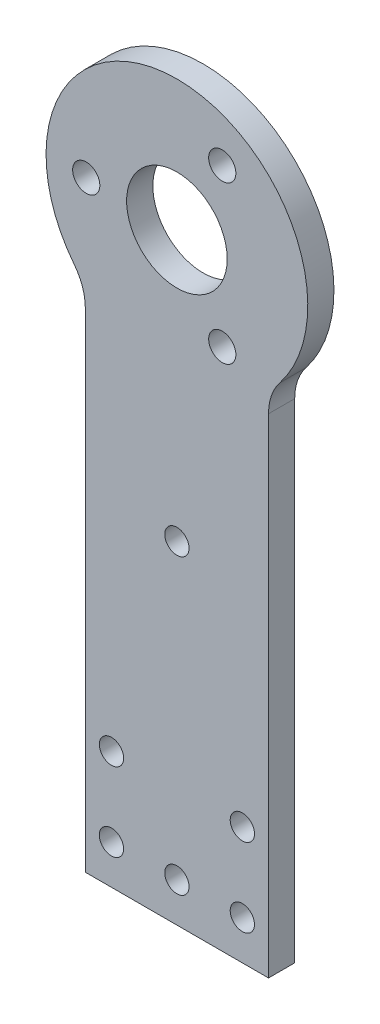
ISO-10303-21;
HEADER;
FILE_DESCRIPTION(('STEP AP214'),'2;1');
FILE_NAME('part.step','',(''),(''),'','','');
FILE_SCHEMA(('AUTOMOTIVE_DESIGN { 1 0 10303 214 1 1 1 1 }'));
ENDSEC;
DATA;
#1=APPLICATION_CONTEXT('core data for automotive mechanical design processes');
#2=APPLICATION_PROTOCOL_DEFINITION('international standard','automotive_design',2000,#1);
#3=PRODUCT_CONTEXT('',#1,'mechanical');
#4=PRODUCT('Part','Part','',(#3));
#5=PRODUCT_RELATED_PRODUCT_CATEGORY('part','',(#4));
#6=PRODUCT_DEFINITION_FORMATION('','',#4);
#7=PRODUCT_DEFINITION_CONTEXT('part definition',#1,'design');
#8=PRODUCT_DEFINITION('design','',#6,#7);
#9=PRODUCT_DEFINITION_SHAPE('','',#8);
#10=(LENGTH_UNIT() NAMED_UNIT(*) SI_UNIT(.MILLI.,.METRE.));
#11=(NAMED_UNIT(*) PLANE_ANGLE_UNIT() SI_UNIT($,.RADIAN.));
#12=(NAMED_UNIT(*) SI_UNIT($,.STERADIAN.) SOLID_ANGLE_UNIT());
#13=UNCERTAINTY_MEASURE_WITH_UNIT(LENGTH_MEASURE(1.E-05),#10,'distance_accuracy_value','');
#14=(GEOMETRIC_REPRESENTATION_CONTEXT(3) GLOBAL_UNCERTAINTY_ASSIGNED_CONTEXT((#13)) GLOBAL_UNIT_ASSIGNED_CONTEXT((#10,
#11,#12)) REPRESENTATION_CONTEXT('',''));
#15=CARTESIAN_POINT('',(0.,0.,0.));
#16=DIRECTION('',(0.,0.,1.));
#17=DIRECTION('',(1.,0.,0.));
#18=AXIS2_PLACEMENT_3D('',#15,#16,#17);
#19=CARTESIAN_POINT('',(0.,0.,0.));
#20=DIRECTION('',(0.,0.,1.));
#21=DIRECTION('',(1.,0.,0.));
#22=AXIS2_PLACEMENT_3D('',#19,#20,#21);
#23=PLANE('',#22);
#24=CARTESIAN_POINT('',(0.,-32.7025,0.));
#25=DIRECTION('',(0.,0.,-1.));
#26=DIRECTION('',(-1.,0.,0.));
#27=AXIS2_PLACEMENT_3D('',#24,#25,#26);
#28=CIRCLE('',#27,1.47319999999999);
#29=CARTESIAN_POINT('',(-1.47319999999999,-32.7025,0.));
#30=VERTEX_POINT('',#29);
#31=EDGE_CURVE('E369',#30,#30,#28,.T.);
#32=ORIENTED_EDGE('',*,*,#31,.F.);
#33=EDGE_LOOP('',(#32));
#34=FACE_BOUND('',#33,.T.);
#35=CARTESIAN_POINT('',(-7.9375,-68.2625,0.));
#36=DIRECTION('',(0.,0.,-1.));
#37=DIRECTION('',(-1.,0.,0.));
#38=AXIS2_PLACEMENT_3D('',#35,#36,#37);
#39=CIRCLE('',#38,1.4732);
#40=CARTESIAN_POINT('',(-9.4107,-68.2625,0.));
#41=VERTEX_POINT('',#40);
#42=EDGE_CURVE('E363',#41,#41,#39,.T.);
#43=ORIENTED_EDGE('',*,*,#42,.F.);
#44=EDGE_LOOP('',(#43));
#45=FACE_BOUND('',#44,.T.);
#46=CARTESIAN_POINT('',(7.9375,-68.2625,0.));
#47=DIRECTION('',(0.,0.,-1.));
#48=DIRECTION('',(-1.,0.,0.));
#49=AXIS2_PLACEMENT_3D('',#46,#47,#48);
#50=CIRCLE('',#49,1.4732);
#51=CARTESIAN_POINT('',(6.4643,-68.2625,0.));
#52=VERTEX_POINT('',#51);
#53=EDGE_CURVE('E357',#52,#52,#50,.T.);
#54=ORIENTED_EDGE('',*,*,#53,.F.);
#55=EDGE_LOOP('',(#54));
#56=FACE_BOUND('',#55,.T.);
#57=CARTESIAN_POINT('',(7.9375,-58.7375,0.));
#58=DIRECTION('',(0.,0.,-1.));
#59=DIRECTION('',(-1.,0.,0.));
#60=AXIS2_PLACEMENT_3D('',#57,#58,#59);
#61=CIRCLE('',#60,1.4732);
#62=CARTESIAN_POINT('',(6.4643,-58.7375,0.));
#63=VERTEX_POINT('',#62);
#64=EDGE_CURVE('E351',#63,#63,#61,.T.);
#65=ORIENTED_EDGE('',*,*,#64,.F.);
#66=EDGE_LOOP('',(#65));
#67=FACE_BOUND('',#66,.T.);
#68=CARTESIAN_POINT('',(-7.9375,-58.7375,0.));
#69=DIRECTION('',(0.,0.,-1.));
#70=DIRECTION('',(-1.,0.,0.));
#71=AXIS2_PLACEMENT_3D('',#68,#69,#70);
#72=CIRCLE('',#71,1.4732);
#73=CARTESIAN_POINT('',(-9.4107,-58.7375,0.));
#74=VERTEX_POINT('',#73);
#75=EDGE_CURVE('E345',#74,#74,#72,.T.);
#76=ORIENTED_EDGE('',*,*,#75,.F.);
#77=EDGE_LOOP('',(#76));
#78=FACE_BOUND('',#77,.T.);
#79=CARTESIAN_POINT('',(0.,0.,0.));
#80=DIRECTION('',(0.,0.,1.));
#81=DIRECTION('',(1.,0.,0.));
#82=AXIS2_PLACEMENT_3D('',#79,#80,#81);
#83=CIRCLE('',#82,15.875);
#84=CARTESIAN_POINT('',(12.4732142857143,-9.8201094893414,0.));
#85=VERTEX_POINT('',#84);
#86=CARTESIAN_POINT('',(-12.4732142857143,-9.82010948934141,0.));
#87=VERTEX_POINT('',#86);
#88=EDGE_CURVE('E119',#85,#87,#83,.T.);
#89=ORIENTED_EDGE('',*,*,#88,.F.);
#90=CARTESIAN_POINT('',(17.4625,-13.748153285078,0.));
#91=DIRECTION('',(0.,0.,1.));
#92=DIRECTION('',(1.,0.,0.));
#93=AXIS2_PLACEMENT_3D('',#90,#91,#92);
#94=CIRCLE('',#93,6.35);
#95=CARTESIAN_POINT('',(11.1125,-13.748153285078,0.));
#96=VERTEX_POINT('',#95);
#97=EDGE_CURVE('E43',#85,#96,#94,.T.);
#98=ORIENTED_EDGE('',*,*,#97,.T.);
#99=DIRECTION('',(0.,1.,0.));
#100=VECTOR('',#99,1.);
#101=CARTESIAN_POINT('',(11.1125,-11.3370176303118,0.));
#102=LINE('',#101,#100);
#103=CARTESIAN_POINT('',(11.1125,-73.025,0.));
#104=VERTEX_POINT('',#103);
#105=EDGE_CURVE('E126',#104,#96,#102,.T.);
#106=ORIENTED_EDGE('',*,*,#105,.F.);
#107=DIRECTION('',(1.,0.,0.));
#108=VECTOR('',#107,1.);
#109=CARTESIAN_POINT('',(11.1125,-73.025,0.));
#110=LINE('',#109,#108);
#111=CARTESIAN_POINT('',(-11.1125,-73.025,0.));
#112=VERTEX_POINT('',#111);
#113=EDGE_CURVE('E124',#112,#104,#110,.T.);
#114=ORIENTED_EDGE('',*,*,#113,.F.);
#115=DIRECTION('',(0.,-1.,0.));
#116=VECTOR('',#115,1.);
#117=CARTESIAN_POINT('',(-11.1125,-11.3370176303118,0.));
#118=LINE('',#117,#116);
#119=CARTESIAN_POINT('',(-11.1125,-13.748153285078,0.));
#120=VERTEX_POINT('',#119);
#121=EDGE_CURVE('E106',#120,#112,#118,.T.);
#122=ORIENTED_EDGE('',*,*,#121,.F.);
#123=CARTESIAN_POINT('',(-17.4625,-13.748153285078,0.));
#124=DIRECTION('',(0.,0.,1.));
#125=DIRECTION('',(1.,0.,0.));
#126=AXIS2_PLACEMENT_3D('',#123,#124,#125);
#127=CIRCLE('',#126,6.35);
#128=EDGE_CURVE('E136',#120,#87,#127,.T.);
#129=ORIENTED_EDGE('',*,*,#128,.T.);
#130=EDGE_LOOP('',(#89,#98,#106,#114,#122,#129));
#131=FACE_BOUND('',#130,.T.);
#132=CARTESIAN_POINT('',(-11.,0.,0.));
#133=DIRECTION('',(0.,0.,1.));
#134=DIRECTION('',(1.,0.,0.));
#135=AXIS2_PLACEMENT_3D('',#132,#133,#134);
#136=CIRCLE('',#135,1.65);
#137=CARTESIAN_POINT('',(-9.35,0.,0.));
#138=VERTEX_POINT('',#137);
#139=EDGE_CURVE('E319',#138,#138,#136,.T.);
#140=ORIENTED_EDGE('',*,*,#139,.T.);
#141=EDGE_LOOP('',(#140));
#142=FACE_BOUND('',#141,.T.);
#143=CARTESIAN_POINT('',(5.5,9.52627944162883,0.));
#144=DIRECTION('',(0.,0.,1.));
#145=DIRECTION('',(1.,0.,0.));
#146=AXIS2_PLACEMENT_3D('',#143,#144,#145);
#147=CIRCLE('',#146,1.65);
#148=CARTESIAN_POINT('',(7.15,9.52627944162883,0.));
#149=VERTEX_POINT('',#148);
#150=EDGE_CURVE('E324',#149,#149,#147,.T.);
#151=ORIENTED_EDGE('',*,*,#150,.T.);
#152=EDGE_LOOP('',(#151));
#153=FACE_BOUND('',#152,.T.);
#154=CARTESIAN_POINT('',(5.50000000000001,-9.52627944162882,0.));
#155=DIRECTION('',(0.,0.,1.));
#156=DIRECTION('',(1.,0.,0.));
#157=AXIS2_PLACEMENT_3D('',#154,#155,#156);
#158=CIRCLE('',#157,1.65);
#159=CARTESIAN_POINT('',(7.15000000000001,-9.52627944162882,0.));
#160=VERTEX_POINT('',#159);
#161=EDGE_CURVE('E331',#160,#160,#158,.T.);
#162=ORIENTED_EDGE('',*,*,#161,.T.);
#163=EDGE_LOOP('',(#162));
#164=FACE_BOUND('',#163,.T.);
#165=CARTESIAN_POINT('',(0.,0.,0.));
#166=DIRECTION('',(0.,0.,1.));
#167=DIRECTION('',(1.,0.,0.));
#168=AXIS2_PLACEMENT_3D('',#165,#166,#167);
#169=CIRCLE('',#168,6.1);
#170=CARTESIAN_POINT('',(6.1,0.,0.));
#171=VERTEX_POINT('',#170);
#172=EDGE_CURVE('E337',#171,#171,#169,.T.);
#173=ORIENTED_EDGE('',*,*,#172,.T.);
#174=EDGE_LOOP('',(#173));
#175=FACE_BOUND('',#174,.T.);
#176=CARTESIAN_POINT('',(0.,-68.2625,0.));
#177=DIRECTION('',(0.,0.,-1.));
#178=DIRECTION('',(-1.,0.,0.));
#179=AXIS2_PLACEMENT_3D('',#176,#177,#178);
#180=CIRCLE('',#179,1.47319999999999);
#181=CARTESIAN_POINT('',(-1.47319999999999,-68.2625,0.));
#182=VERTEX_POINT('',#181);
#183=EDGE_CURVE('E375',#182,#182,#180,.T.);
#184=ORIENTED_EDGE('',*,*,#183,.F.);
#185=EDGE_LOOP('',(#184));
#186=FACE_BOUND('',#185,.T.);
#187=ADVANCED_FACE('F35',(#34,#45,#56,#67,#78,#131,#142,#153,#164,#175,#186),#23,.F.);
#188=CARTESIAN_POINT('',(0.,0.,3.175));
#189=DIRECTION('',(0.,0.,1.));
#190=DIRECTION('',(1.,0.,0.));
#191=AXIS2_PLACEMENT_3D('',#188,#189,#190);
#192=PLANE('',#191);
#193=CARTESIAN_POINT('',(0.,-68.2625,3.175));
#194=DIRECTION('',(0.,0.,1.));
#195=DIRECTION('',(1.,0.,0.));
#196=AXIS2_PLACEMENT_3D('',#193,#194,#195);
#197=CIRCLE('',#196,1.47319999999999);
#198=CARTESIAN_POINT('',(1.47319999999999,-68.2625,3.175));
#199=VERTEX_POINT('',#198);
#200=EDGE_CURVE('E372',#199,#199,#197,.T.);
#201=ORIENTED_EDGE('',*,*,#200,.F.);
#202=EDGE_LOOP('',(#201));
#203=FACE_BOUND('',#202,.T.);
#204=CARTESIAN_POINT('',(0.,-32.7025,3.175));
#205=DIRECTION('',(0.,0.,1.));
#206=DIRECTION('',(1.,0.,0.));
#207=AXIS2_PLACEMENT_3D('',#204,#205,#206);
#208=CIRCLE('',#207,1.47319999999999);
#209=CARTESIAN_POINT('',(1.47319999999999,-32.7025,3.175));
#210=VERTEX_POINT('',#209);
#211=EDGE_CURVE('E366',#210,#210,#208,.T.);
#212=ORIENTED_EDGE('',*,*,#211,.F.);
#213=EDGE_LOOP('',(#212));
#214=FACE_BOUND('',#213,.T.);
#215=CARTESIAN_POINT('',(-7.9375,-68.2625,3.175));
#216=DIRECTION('',(0.,0.,1.));
#217=DIRECTION('',(1.,0.,0.));
#218=AXIS2_PLACEMENT_3D('',#215,#216,#217);
#219=CIRCLE('',#218,1.4732);
#220=CARTESIAN_POINT('',(-6.4643,-68.2625,3.175));
#221=VERTEX_POINT('',#220);
#222=EDGE_CURVE('E360',#221,#221,#219,.T.);
#223=ORIENTED_EDGE('',*,*,#222,.F.);
#224=EDGE_LOOP('',(#223));
#225=FACE_BOUND('',#224,.T.);
#226=CARTESIAN_POINT('',(7.9375,-68.2625,3.175));
#227=DIRECTION('',(0.,0.,1.));
#228=DIRECTION('',(1.,0.,0.));
#229=AXIS2_PLACEMENT_3D('',#226,#227,#228);
#230=CIRCLE('',#229,1.4732);
#231=CARTESIAN_POINT('',(9.4107,-68.2625,3.175));
#232=VERTEX_POINT('',#231);
#233=EDGE_CURVE('E354',#232,#232,#230,.T.);
#234=ORIENTED_EDGE('',*,*,#233,.F.);
#235=EDGE_LOOP('',(#234));
#236=FACE_BOUND('',#235,.T.);
#237=CARTESIAN_POINT('',(7.9375,-58.7375,3.175));
#238=DIRECTION('',(0.,0.,1.));
#239=DIRECTION('',(1.,0.,0.));
#240=AXIS2_PLACEMENT_3D('',#237,#238,#239);
#241=CIRCLE('',#240,1.4732);
#242=CARTESIAN_POINT('',(9.4107,-58.7375,3.175));
#243=VERTEX_POINT('',#242);
#244=EDGE_CURVE('E348',#243,#243,#241,.T.);
#245=ORIENTED_EDGE('',*,*,#244,.F.);
#246=EDGE_LOOP('',(#245));
#247=FACE_BOUND('',#246,.T.);
#248=CARTESIAN_POINT('',(-7.9375,-58.7375,3.175));
#249=DIRECTION('',(0.,0.,1.));
#250=DIRECTION('',(1.,0.,0.));
#251=AXIS2_PLACEMENT_3D('',#248,#249,#250);
#252=CIRCLE('',#251,1.4732);
#253=CARTESIAN_POINT('',(-6.4643,-58.7375,3.175));
#254=VERTEX_POINT('',#253);
#255=EDGE_CURVE('E340',#254,#254,#252,.T.);
#256=ORIENTED_EDGE('',*,*,#255,.F.);
#257=EDGE_LOOP('',(#256));
#258=FACE_BOUND('',#257,.T.);
#259=CARTESIAN_POINT('',(5.50000000000001,-9.52627944162882,3.175));
#260=DIRECTION('',(0.,0.,1.));
#261=DIRECTION('',(1.,0.,0.));
#262=AXIS2_PLACEMENT_3D('',#259,#260,#261);
#263=CIRCLE('',#262,1.65);
#264=CARTESIAN_POINT('',(7.15000000000001,-9.52627944162882,3.175));
#265=VERTEX_POINT('',#264);
#266=EDGE_CURVE('E329',#265,#265,#263,.T.);
#267=ORIENTED_EDGE('',*,*,#266,.F.);
#268=EDGE_LOOP('',(#267));
#269=FACE_BOUND('',#268,.T.);
#270=CARTESIAN_POINT('',(-11.,0.,3.175));
#271=DIRECTION('',(0.,0.,1.));
#272=DIRECTION('',(1.,0.,0.));
#273=AXIS2_PLACEMENT_3D('',#270,#271,#272);
#274=CIRCLE('',#273,1.65);
#275=CARTESIAN_POINT('',(-9.35,0.,3.175));
#276=VERTEX_POINT('',#275);
#277=EDGE_CURVE('E122',#276,#276,#274,.T.);
#278=ORIENTED_EDGE('',*,*,#277,.F.);
#279=EDGE_LOOP('',(#278));
#280=FACE_BOUND('',#279,.T.);
#281=DIRECTION('',(0.,1.,0.));
#282=VECTOR('',#281,1.);
#283=CARTESIAN_POINT('',(11.1125,-11.3370176303118,3.175));
#284=LINE('',#283,#282);
#285=CARTESIAN_POINT('',(11.1125,-73.025,3.175));
#286=VERTEX_POINT('',#285);
#287=CARTESIAN_POINT('',(11.1125,-13.748153285078,3.175));
#288=VERTEX_POINT('',#287);
#289=EDGE_CURVE('E114',#286,#288,#284,.T.);
#290=ORIENTED_EDGE('',*,*,#289,.T.);
#291=CARTESIAN_POINT('',(17.4625,-13.748153285078,3.175));
#292=DIRECTION('',(0.,0.,1.));
#293=DIRECTION('',(1.,0.,0.));
#294=AXIS2_PLACEMENT_3D('',#291,#292,#293);
#295=CIRCLE('',#294,6.35);
#296=CARTESIAN_POINT('',(12.4732142857143,-9.8201094893414,3.175));
#297=VERTEX_POINT('',#296);
#298=EDGE_CURVE('E11',#288,#297,#295,.F.);
#299=ORIENTED_EDGE('',*,*,#298,.T.);
#300=CARTESIAN_POINT('',(0.,0.,3.175));
#301=DIRECTION('',(0.,0.,1.));
#302=DIRECTION('',(1.,0.,0.));
#303=AXIS2_PLACEMENT_3D('',#300,#301,#302);
#304=CIRCLE('',#303,15.875);
#305=CARTESIAN_POINT('',(-12.4732142857143,-9.82010948934141,3.175));
#306=VERTEX_POINT('',#305);
#307=EDGE_CURVE('E100',#297,#306,#304,.T.);
#308=ORIENTED_EDGE('',*,*,#307,.T.);
#309=CARTESIAN_POINT('',(-17.4625,-13.748153285078,3.175));
#310=DIRECTION('',(0.,0.,1.));
#311=DIRECTION('',(1.,0.,0.));
#312=AXIS2_PLACEMENT_3D('',#309,#310,#311);
#313=CIRCLE('',#312,6.35);
#314=CARTESIAN_POINT('',(-11.1125,-13.748153285078,3.175));
#315=VERTEX_POINT('',#314);
#316=EDGE_CURVE('E96',#306,#315,#313,.F.);
#317=ORIENTED_EDGE('',*,*,#316,.T.);
#318=DIRECTION('',(0.,-1.,0.));
#319=VECTOR('',#318,1.);
#320=CARTESIAN_POINT('',(-11.1125,-11.3370176303118,3.175));
#321=LINE('',#320,#319);
#322=CARTESIAN_POINT('',(-11.1125,-73.025,3.175));
#323=VERTEX_POINT('',#322);
#324=EDGE_CURVE('E87',#315,#323,#321,.T.);
#325=ORIENTED_EDGE('',*,*,#324,.T.);
#326=DIRECTION('',(1.,0.,0.));
#327=VECTOR('',#326,1.);
#328=CARTESIAN_POINT('',(11.1125,-73.025,3.175));
#329=LINE('',#328,#327);
#330=EDGE_CURVE('E92',#323,#286,#329,.T.);
#331=ORIENTED_EDGE('',*,*,#330,.T.);
#332=EDGE_LOOP('',(#290,#299,#308,#317,#325,#331));
#333=FACE_BOUND('',#332,.T.);
#334=CARTESIAN_POINT('',(5.5,9.52627944162883,3.175));
#335=DIRECTION('',(0.,0.,1.));
#336=DIRECTION('',(1.,0.,0.));
#337=AXIS2_PLACEMENT_3D('',#334,#335,#336);
#338=CIRCLE('',#337,1.65);
#339=CARTESIAN_POINT('',(7.15,9.52627944162883,3.175));
#340=VERTEX_POINT('',#339);
#341=EDGE_CURVE('E320',#340,#340,#338,.T.);
#342=ORIENTED_EDGE('',*,*,#341,.F.);
#343=EDGE_LOOP('',(#342));
#344=FACE_BOUND('',#343,.T.);
#345=CARTESIAN_POINT('',(0.,0.,3.175));
#346=DIRECTION('',(0.,0.,1.));
#347=DIRECTION('',(1.,0.,0.));
#348=AXIS2_PLACEMENT_3D('',#345,#346,#347);
#349=CIRCLE('',#348,6.1);
#350=CARTESIAN_POINT('',(6.1,0.,3.175));
#351=VERTEX_POINT('',#350);
#352=EDGE_CURVE('E334',#351,#351,#349,.T.);
#353=ORIENTED_EDGE('',*,*,#352,.F.);
#354=EDGE_LOOP('',(#353));
#355=FACE_BOUND('',#354,.T.);
#356=ADVANCED_FACE('F89',(#203,#214,#225,#236,#247,#258,#269,#280,#333,#344,#355),#192,.T.);
#357=CARTESIAN_POINT('',(0.,0.,3.175));
#358=DIRECTION('',(0.,0.,-1.));
#359=DIRECTION('',(-1.,0.,0.));
#360=AXIS2_PLACEMENT_3D('',#357,#358,#359);
#361=CYLINDRICAL_SURFACE('',#360,15.875);
#362=ORIENTED_EDGE('',*,*,#88,.T.);
#363=DIRECTION('',(0.,0.,-1.));
#364=VECTOR('',#363,1.);
#365=CARTESIAN_POINT('',(-12.4732142857143,-9.82010948934141,3.175));
#366=LINE('',#365,#364);
#367=EDGE_CURVE('E133',#87,#306,#366,.F.);
#368=ORIENTED_EDGE('',*,*,#367,.T.);
#369=ORIENTED_EDGE('',*,*,#307,.F.);
#370=DIRECTION('',(0.,0.,-1.));
#371=VECTOR('',#370,1.);
#372=CARTESIAN_POINT('',(12.4732142857143,-9.82010948934141,3.175));
#373=LINE('',#372,#371);
#374=EDGE_CURVE('E130',#297,#85,#373,.T.);
#375=ORIENTED_EDGE('',*,*,#374,.T.);
#376=EDGE_LOOP('',(#362,#368,#369,#375));
#377=FACE_BOUND('',#376,.T.);
#378=ADVANCED_FACE('F142',(#377),#361,.T.);
#379=CARTESIAN_POINT('',(-11.1125,-11.3370176303118,3.175));
#380=DIRECTION('',(1.,0.,0.));
#381=DIRECTION('',(0.,1.,0.));
#382=AXIS2_PLACEMENT_3D('',#379,#380,#381);
#383=PLANE('',#382);
#384=ORIENTED_EDGE('',*,*,#324,.F.);
#385=DIRECTION('',(0.,0.,1.));
#386=VECTOR('',#385,1.);
#387=CARTESIAN_POINT('',(-11.1125,-13.748153285078,0.));
#388=LINE('',#387,#386);
#389=EDGE_CURVE('E109',#315,#120,#388,.F.);
#390=ORIENTED_EDGE('',*,*,#389,.T.);
#391=ORIENTED_EDGE('',*,*,#121,.T.);
#392=DIRECTION('',(0.,0.,-1.));
#393=VECTOR('',#392,1.);
#394=CARTESIAN_POINT('',(-11.1125,-73.025,3.175));
#395=LINE('',#394,#393);
#396=EDGE_CURVE('E103',#323,#112,#395,.T.);
#397=ORIENTED_EDGE('',*,*,#396,.F.);
#398=EDGE_LOOP('',(#384,#390,#391,#397));
#399=FACE_BOUND('',#398,.T.);
#400=ADVANCED_FACE('F104',(#399),#383,.F.);
#401=CARTESIAN_POINT('',(11.1125,-73.025,3.175));
#402=DIRECTION('',(0.,1.,0.));
#403=DIRECTION('',(0.,0.,1.));
#404=AXIS2_PLACEMENT_3D('',#401,#402,#403);
#405=PLANE('',#404);
#406=ORIENTED_EDGE('',*,*,#113,.T.);
#407=DIRECTION('',(0.,0.,-1.));
#408=VECTOR('',#407,1.);
#409=CARTESIAN_POINT('',(11.1125,-73.025,3.175));
#410=LINE('',#409,#408);
#411=EDGE_CURVE('E110',#286,#104,#410,.T.);
#412=ORIENTED_EDGE('',*,*,#411,.F.);
#413=ORIENTED_EDGE('',*,*,#330,.F.);
#414=ORIENTED_EDGE('',*,*,#396,.T.);
#415=EDGE_LOOP('',(#406,#412,#413,#414));
#416=FACE_BOUND('',#415,.T.);
#417=ADVANCED_FACE('F112',(#416),#405,.F.);
#418=CARTESIAN_POINT('',(11.1125,-11.3370176303118,3.175));
#419=DIRECTION('',(-1.,0.,0.));
#420=DIRECTION('',(0.,-1.,0.));
#421=AXIS2_PLACEMENT_3D('',#418,#419,#420);
#422=PLANE('',#421);
#423=ORIENTED_EDGE('',*,*,#105,.T.);
#424=DIRECTION('',(0.,0.,1.));
#425=VECTOR('',#424,1.);
#426=CARTESIAN_POINT('',(11.1125,-13.748153285078,3.175));
#427=LINE('',#426,#425);
#428=EDGE_CURVE('E50',#96,#288,#427,.T.);
#429=ORIENTED_EDGE('',*,*,#428,.T.);
#430=ORIENTED_EDGE('',*,*,#289,.F.);
#431=ORIENTED_EDGE('',*,*,#411,.T.);
#432=EDGE_LOOP('',(#423,#429,#430,#431));
#433=FACE_BOUND('',#432,.T.);
#434=ADVANCED_FACE('F170',(#433),#422,.F.);
#435=CARTESIAN_POINT('',(-11.,0.,3.175));
#436=DIRECTION('',(0.,0.,-1.));
#437=DIRECTION('',(-1.,0.,0.));
#438=AXIS2_PLACEMENT_3D('',#435,#436,#437);
#439=CYLINDRICAL_SURFACE('',#438,1.65);
#440=ORIENTED_EDGE('',*,*,#277,.T.);
#441=EDGE_LOOP('',(#440));
#442=FACE_BOUND('',#441,.T.);
#443=ORIENTED_EDGE('',*,*,#139,.F.);
#444=EDGE_LOOP('',(#443));
#445=FACE_BOUND('',#444,.T.);
#446=ADVANCED_FACE('F173',(#442,#445),#439,.F.);
#447=CARTESIAN_POINT('',(5.5,9.52627944162883,3.175));
#448=DIRECTION('',(0.,0.,-1.));
#449=DIRECTION('',(-1.,0.,0.));
#450=AXIS2_PLACEMENT_3D('',#447,#448,#449);
#451=CYLINDRICAL_SURFACE('',#450,1.65);
#452=ORIENTED_EDGE('',*,*,#341,.T.);
#453=EDGE_LOOP('',(#452));
#454=FACE_BOUND('',#453,.T.);
#455=ORIENTED_EDGE('',*,*,#150,.F.);
#456=EDGE_LOOP('',(#455));
#457=FACE_BOUND('',#456,.T.);
#458=ADVANCED_FACE('F271',(#454,#457),#451,.F.);
#459=CARTESIAN_POINT('',(5.50000000000001,-9.52627944162882,3.175));
#460=DIRECTION('',(0.,0.,-1.));
#461=DIRECTION('',(-1.,0.,0.));
#462=AXIS2_PLACEMENT_3D('',#459,#460,#461);
#463=CYLINDRICAL_SURFACE('',#462,1.65);
#464=ORIENTED_EDGE('',*,*,#266,.T.);
#465=EDGE_LOOP('',(#464));
#466=FACE_BOUND('',#465,.T.);
#467=ORIENTED_EDGE('',*,*,#161,.F.);
#468=EDGE_LOOP('',(#467));
#469=FACE_BOUND('',#468,.T.);
#470=ADVANCED_FACE('F262',(#466,#469),#463,.F.);
#471=CARTESIAN_POINT('',(0.,0.,3.175));
#472=DIRECTION('',(0.,0.,-1.));
#473=DIRECTION('',(-1.,0.,0.));
#474=AXIS2_PLACEMENT_3D('',#471,#472,#473);
#475=CYLINDRICAL_SURFACE('',#474,6.1);
#476=ORIENTED_EDGE('',*,*,#352,.T.);
#477=EDGE_LOOP('',(#476));
#478=FACE_BOUND('',#477,.T.);
#479=ORIENTED_EDGE('',*,*,#172,.F.);
#480=EDGE_LOOP('',(#479));
#481=FACE_BOUND('',#480,.T.);
#482=ADVANCED_FACE('F253',(#478,#481),#475,.F.);
#483=CARTESIAN_POINT('',(-7.9375,-58.7375,0.));
#484=DIRECTION('',(0.,0.,-1.));
#485=DIRECTION('',(-1.,0.,0.));
#486=AXIS2_PLACEMENT_3D('',#483,#484,#485);
#487=CYLINDRICAL_SURFACE('',#486,1.4732);
#488=ORIENTED_EDGE('',*,*,#255,.T.);
#489=EDGE_LOOP('',(#488));
#490=FACE_BOUND('',#489,.T.);
#491=ORIENTED_EDGE('',*,*,#75,.T.);
#492=EDGE_LOOP('',(#491));
#493=FACE_BOUND('',#492,.T.);
#494=ADVANCED_FACE('F244',(#490,#493),#487,.F.);
#495=CARTESIAN_POINT('',(7.9375,-58.7375,0.));
#496=DIRECTION('',(0.,0.,-1.));
#497=DIRECTION('',(-1.,0.,0.));
#498=AXIS2_PLACEMENT_3D('',#495,#496,#497);
#499=CYLINDRICAL_SURFACE('',#498,1.4732);
#500=ORIENTED_EDGE('',*,*,#244,.T.);
#501=EDGE_LOOP('',(#500));
#502=FACE_BOUND('',#501,.T.);
#503=ORIENTED_EDGE('',*,*,#64,.T.);
#504=EDGE_LOOP('',(#503));
#505=FACE_BOUND('',#504,.T.);
#506=ADVANCED_FACE('F235',(#502,#505),#499,.F.);
#507=CARTESIAN_POINT('',(7.9375,-68.2625,0.));
#508=DIRECTION('',(0.,0.,-1.));
#509=DIRECTION('',(-1.,0.,0.));
#510=AXIS2_PLACEMENT_3D('',#507,#508,#509);
#511=CYLINDRICAL_SURFACE('',#510,1.4732);
#512=ORIENTED_EDGE('',*,*,#233,.T.);
#513=EDGE_LOOP('',(#512));
#514=FACE_BOUND('',#513,.T.);
#515=ORIENTED_EDGE('',*,*,#53,.T.);
#516=EDGE_LOOP('',(#515));
#517=FACE_BOUND('',#516,.T.);
#518=ADVANCED_FACE('F226',(#514,#517),#511,.F.);
#519=CARTESIAN_POINT('',(-7.9375,-68.2625,0.));
#520=DIRECTION('',(0.,0.,-1.));
#521=DIRECTION('',(-1.,0.,0.));
#522=AXIS2_PLACEMENT_3D('',#519,#520,#521);
#523=CYLINDRICAL_SURFACE('',#522,1.4732);
#524=ORIENTED_EDGE('',*,*,#222,.T.);
#525=EDGE_LOOP('',(#524));
#526=FACE_BOUND('',#525,.T.);
#527=ORIENTED_EDGE('',*,*,#42,.T.);
#528=EDGE_LOOP('',(#527));
#529=FACE_BOUND('',#528,.T.);
#530=ADVANCED_FACE('F213',(#526,#529),#523,.F.);
#531=CARTESIAN_POINT('',(0.,-32.7025,0.));
#532=DIRECTION('',(0.,0.,-1.));
#533=DIRECTION('',(-1.,0.,0.));
#534=AXIS2_PLACEMENT_3D('',#531,#532,#533);
#535=CYLINDRICAL_SURFACE('',#534,1.47319999999999);
#536=ORIENTED_EDGE('',*,*,#31,.T.);
#537=EDGE_LOOP('',(#536));
#538=FACE_BOUND('',#537,.T.);
#539=ORIENTED_EDGE('',*,*,#211,.T.);
#540=EDGE_LOOP('',(#539));
#541=FACE_BOUND('',#540,.T.);
#542=ADVANCED_FACE('F153',(#538,#541),#535,.F.);
#543=CARTESIAN_POINT('',(0.,-68.2625,0.));
#544=DIRECTION('',(0.,0.,-1.));
#545=DIRECTION('',(-1.,0.,0.));
#546=AXIS2_PLACEMENT_3D('',#543,#544,#545);
#547=CYLINDRICAL_SURFACE('',#546,1.47319999999999);
#548=ORIENTED_EDGE('',*,*,#183,.T.);
#549=EDGE_LOOP('',(#548));
#550=FACE_BOUND('',#549,.T.);
#551=ORIENTED_EDGE('',*,*,#200,.T.);
#552=EDGE_LOOP('',(#551));
#553=FACE_BOUND('',#552,.T.);
#554=ADVANCED_FACE('F147',(#550,#553),#547,.F.);
#555=CARTESIAN_POINT('',(-17.4625,-13.748153285078,3.175));
#556=DIRECTION('',(0.,0.,-1.));
#557=DIRECTION('',(-1.,0.,0.));
#558=AXIS2_PLACEMENT_3D('',#555,#556,#557);
#559=CYLINDRICAL_SURFACE('',#558,6.35);
#560=ORIENTED_EDGE('',*,*,#316,.F.);
#561=ORIENTED_EDGE('',*,*,#367,.F.);
#562=ORIENTED_EDGE('',*,*,#128,.F.);
#563=ORIENTED_EDGE('',*,*,#389,.F.);
#564=EDGE_LOOP('',(#560,#561,#562,#563));
#565=FACE_BOUND('',#564,.T.);
#566=ADVANCED_FACE('F145',(#565),#559,.F.);
#567=CARTESIAN_POINT('',(17.4625,-13.748153285078,3.175));
#568=DIRECTION('',(0.,0.,-1.));
#569=DIRECTION('',(-1.,0.,0.));
#570=AXIS2_PLACEMENT_3D('',#567,#568,#569);
#571=CYLINDRICAL_SURFACE('',#570,6.35);
#572=ORIENTED_EDGE('',*,*,#298,.F.);
#573=ORIENTED_EDGE('',*,*,#428,.F.);
#574=ORIENTED_EDGE('',*,*,#97,.F.);
#575=ORIENTED_EDGE('',*,*,#374,.F.);
#576=EDGE_LOOP('',(#572,#573,#574,#575));
#577=FACE_BOUND('',#576,.T.);
#578=ADVANCED_FACE('F37',(#577),#571,.F.);
#579=CLOSED_SHELL('',(#187,#356,#378,#400,#417,#434,#446,#458,#470,#482,#494,#506,#518,#530,
#542,#554,#566,#578));
#580=MANIFOLD_SOLID_BREP('B2',#579);
#581=ADVANCED_BREP_SHAPE_REPRESENTATION('',(#18,#580),#14);
#582=SHAPE_DEFINITION_REPRESENTATION(#9,#581);
ENDSEC;
END-ISO-10303-21;
